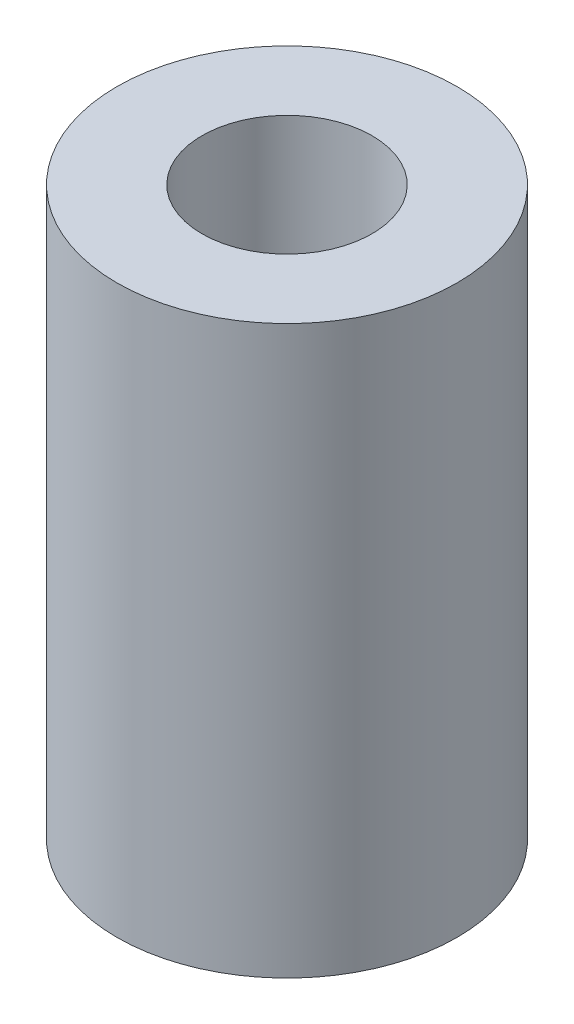
ISO-10303-21;
HEADER;
FILE_DESCRIPTION(('STEP AP214'),'2;1');
FILE_NAME('part.step','',(''),(''),'','','');
FILE_SCHEMA(('AUTOMOTIVE_DESIGN { 1 0 10303 214 1 1 1 1 }'));
ENDSEC;
DATA;
#1=APPLICATION_CONTEXT('core data for automotive mechanical design processes');
#2=APPLICATION_PROTOCOL_DEFINITION('international standard','automotive_design',2000,#1);
#3=PRODUCT_CONTEXT('',#1,'mechanical');
#4=PRODUCT('Part','Part','',(#3));
#5=PRODUCT_RELATED_PRODUCT_CATEGORY('part','',(#4));
#6=PRODUCT_DEFINITION_FORMATION('','',#4);
#7=PRODUCT_DEFINITION_CONTEXT('part definition',#1,'design');
#8=PRODUCT_DEFINITION('design','',#6,#7);
#9=PRODUCT_DEFINITION_SHAPE('','',#8);
#10=(LENGTH_UNIT() NAMED_UNIT(*) SI_UNIT(.MILLI.,.METRE.));
#11=(NAMED_UNIT(*) PLANE_ANGLE_UNIT() SI_UNIT($,.RADIAN.));
#12=(NAMED_UNIT(*) SI_UNIT($,.STERADIAN.) SOLID_ANGLE_UNIT());
#13=UNCERTAINTY_MEASURE_WITH_UNIT(LENGTH_MEASURE(1.E-05),#10,'distance_accuracy_value','');
#14=(GEOMETRIC_REPRESENTATION_CONTEXT(3) GLOBAL_UNCERTAINTY_ASSIGNED_CONTEXT((#13)) GLOBAL_UNIT_ASSIGNED_CONTEXT((#10,
#11,#12)) REPRESENTATION_CONTEXT('',''));
#15=CARTESIAN_POINT('',(0.,0.,0.));
#16=DIRECTION('',(0.,0.,1.));
#17=DIRECTION('',(1.,0.,0.));
#18=AXIS2_PLACEMENT_3D('',#15,#16,#17);
#19=CARTESIAN_POINT('',(0.,10.,0.));
#20=DIRECTION('',(0.,1.,0.));
#21=DIRECTION('',(0.,0.,1.));
#22=AXIS2_PLACEMENT_3D('',#19,#20,#21);
#23=PLANE('',#22);
#24=CARTESIAN_POINT('',(0.,10.,0.));
#25=DIRECTION('',(0.,1.,0.));
#26=DIRECTION('',(0.,0.,1.));
#27=AXIS2_PLACEMENT_3D('',#24,#25,#26);
#28=CIRCLE('',#27,3.);
#29=CARTESIAN_POINT('',(0.,10.,3.));
#30=VERTEX_POINT('',#29);
#31=EDGE_CURVE('E10',#30,#30,#28,.T.);
#32=ORIENTED_EDGE('',*,*,#31,.T.);
#33=EDGE_LOOP('',(#32));
#34=FACE_BOUND('',#33,.T.);
#35=CARTESIAN_POINT('',(0.,10.,0.));
#36=DIRECTION('',(0.,1.,0.));
#37=DIRECTION('',(0.,0.,1.));
#38=AXIS2_PLACEMENT_3D('',#35,#36,#37);
#39=CIRCLE('',#38,1.5);
#40=CARTESIAN_POINT('',(0.,10.,1.5));
#41=VERTEX_POINT('',#40);
#42=EDGE_CURVE('E42',#41,#41,#39,.T.);
#43=ORIENTED_EDGE('',*,*,#42,.F.);
#44=EDGE_LOOP('',(#43));
#45=FACE_BOUND('',#44,.T.);
#46=ADVANCED_FACE('F31',(#34,#45),#23,.T.);
#47=CARTESIAN_POINT('',(0.,0.,0.));
#48=DIRECTION('',(0.,1.,0.));
#49=DIRECTION('',(0.,0.,1.));
#50=AXIS2_PLACEMENT_3D('',#47,#48,#49);
#51=PLANE('',#50);
#52=CARTESIAN_POINT('',(0.,0.,0.));
#53=DIRECTION('',(0.,1.,0.));
#54=DIRECTION('',(0.,0.,1.));
#55=AXIS2_PLACEMENT_3D('',#52,#53,#54);
#56=CIRCLE('',#55,3.);
#57=CARTESIAN_POINT('',(0.,0.,3.));
#58=VERTEX_POINT('',#57);
#59=EDGE_CURVE('E35',#58,#58,#56,.T.);
#60=ORIENTED_EDGE('',*,*,#59,.F.);
#61=EDGE_LOOP('',(#60));
#62=FACE_BOUND('',#61,.T.);
#63=CARTESIAN_POINT('',(0.,0.,0.));
#64=DIRECTION('',(0.,1.,0.));
#65=DIRECTION('',(0.,0.,1.));
#66=AXIS2_PLACEMENT_3D('',#63,#64,#65);
#67=CIRCLE('',#66,1.5);
#68=CARTESIAN_POINT('',(0.,0.,1.5));
#69=VERTEX_POINT('',#68);
#70=EDGE_CURVE('E44',#69,#69,#67,.T.);
#71=ORIENTED_EDGE('',*,*,#70,.T.);
#72=EDGE_LOOP('',(#71));
#73=FACE_BOUND('',#72,.T.);
#74=ADVANCED_FACE('F54',(#62,#73),#51,.F.);
#75=CARTESIAN_POINT('',(0.,10.,0.));
#76=DIRECTION('',(0.,-1.,0.));
#77=DIRECTION('',(0.,0.,-1.));
#78=AXIS2_PLACEMENT_3D('',#75,#76,#77);
#79=CYLINDRICAL_SURFACE('',#78,3.);
#80=ORIENTED_EDGE('',*,*,#31,.F.);
#81=EDGE_LOOP('',(#80));
#82=FACE_BOUND('',#81,.T.);
#83=ORIENTED_EDGE('',*,*,#59,.T.);
#84=EDGE_LOOP('',(#83));
#85=FACE_BOUND('',#84,.T.);
#86=ADVANCED_FACE('F33',(#82,#85),#79,.T.);
#87=CARTESIAN_POINT('',(0.,10.,0.));
#88=DIRECTION('',(0.,-1.,0.));
#89=DIRECTION('',(0.,0.,-1.));
#90=AXIS2_PLACEMENT_3D('',#87,#88,#89);
#91=CYLINDRICAL_SURFACE('',#90,1.5);
#92=ORIENTED_EDGE('',*,*,#42,.T.);
#93=EDGE_LOOP('',(#92));
#94=FACE_BOUND('',#93,.T.);
#95=ORIENTED_EDGE('',*,*,#70,.F.);
#96=EDGE_LOOP('',(#95));
#97=FACE_BOUND('',#96,.T.);
#98=ADVANCED_FACE('F50',(#94,#97),#91,.F.);
#99=CLOSED_SHELL('',(#46,#74,#86,#98));
#100=MANIFOLD_SOLID_BREP('B2',#99);
#101=ADVANCED_BREP_SHAPE_REPRESENTATION('',(#18,#100),#14);
#102=SHAPE_DEFINITION_REPRESENTATION(#9,#101);
ENDSEC;
END-ISO-10303-21;
